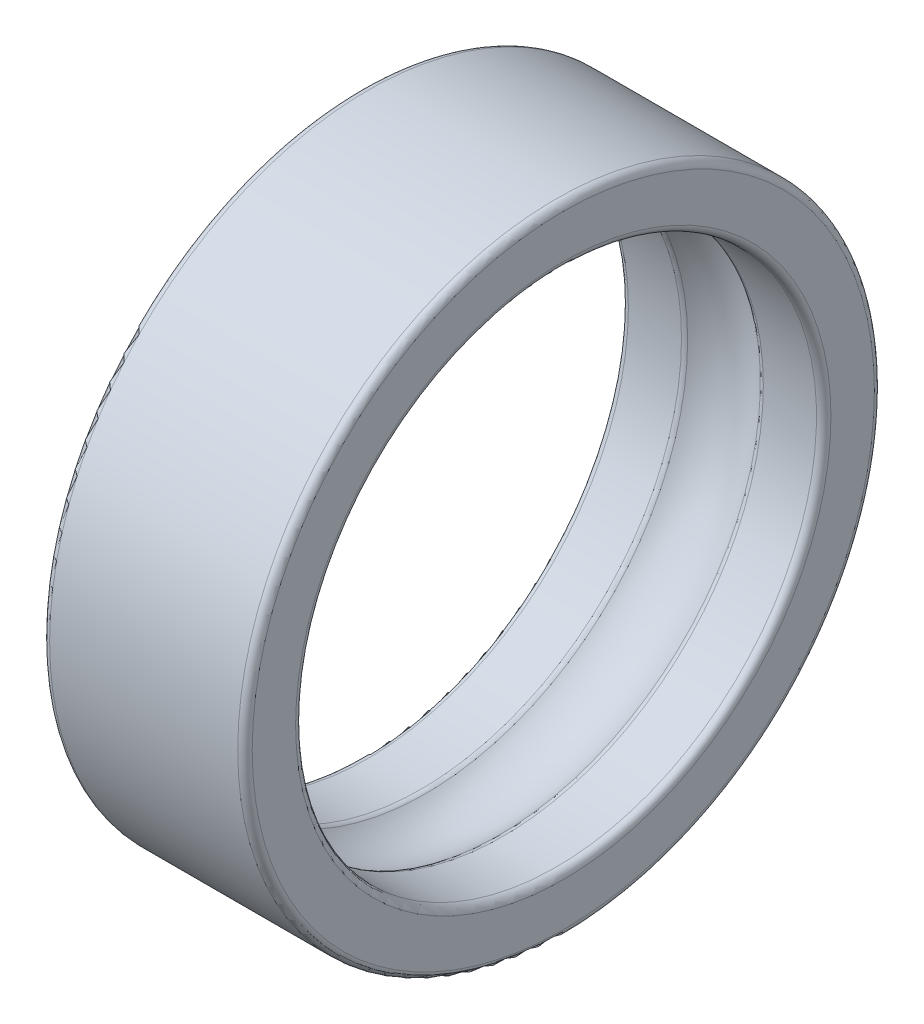
ISO-10303-21;
HEADER;
FILE_DESCRIPTION(('STEP AP214'),'2;1');
FILE_NAME('part.step','',(''),(''),'','','');
FILE_SCHEMA(('AUTOMOTIVE_DESIGN { 1 0 10303 214 1 1 1 1 }'));
ENDSEC;
DATA;
#1=APPLICATION_CONTEXT('core data for automotive mechanical design processes');
#2=APPLICATION_PROTOCOL_DEFINITION('international standard','automotive_design',2000,#1);
#3=PRODUCT_CONTEXT('',#1,'mechanical');
#4=PRODUCT('Part','Part','',(#3));
#5=PRODUCT_RELATED_PRODUCT_CATEGORY('part','',(#4));
#6=PRODUCT_DEFINITION_FORMATION('','',#4);
#7=PRODUCT_DEFINITION_CONTEXT('part definition',#1,'design');
#8=PRODUCT_DEFINITION('design','',#6,#7);
#9=PRODUCT_DEFINITION_SHAPE('','',#8);
#10=(LENGTH_UNIT() NAMED_UNIT(*) SI_UNIT(.MILLI.,.METRE.));
#11=(NAMED_UNIT(*) PLANE_ANGLE_UNIT() SI_UNIT($,.RADIAN.));
#12=(NAMED_UNIT(*) SI_UNIT($,.STERADIAN.) SOLID_ANGLE_UNIT());
#13=UNCERTAINTY_MEASURE_WITH_UNIT(LENGTH_MEASURE(1.E-05),#10,'distance_accuracy_value','');
#14=(GEOMETRIC_REPRESENTATION_CONTEXT(3) GLOBAL_UNCERTAINTY_ASSIGNED_CONTEXT((#13)) GLOBAL_UNIT_ASSIGNED_CONTEXT((#10,
#11,#12)) REPRESENTATION_CONTEXT('',''));
#15=CARTESIAN_POINT('',(0.,0.,0.));
#16=DIRECTION('',(0.,0.,1.));
#17=DIRECTION('',(1.,0.,0.));
#18=AXIS2_PLACEMENT_3D('',#15,#16,#17);
#19=CARTESIAN_POINT('',(-3.5,9.,0.));
#20=DIRECTION('',(1.,0.,0.));
#21=DIRECTION('',(0.,0.,-1.));
#22=AXIS2_PLACEMENT_3D('',#19,#20,#21);
#23=PLANE('',#22);
#24=CARTESIAN_POINT('',(-3.5,0.,0.));
#25=DIRECTION('',(1.,0.,0.));
#26=DIRECTION('',(0.,0.,-1.));
#27=AXIS2_PLACEMENT_3D('',#24,#25,#26);
#28=CIRCLE('',#27,10.75);
#29=CARTESIAN_POINT('',(-3.5,0.,-10.75));
#30=VERTEX_POINT('',#29);
#31=EDGE_CURVE('E58',#30,#30,#28,.F.);
#32=ORIENTED_EDGE('',*,*,#31,.T.);
#33=EDGE_LOOP('',(#32));
#34=FACE_BOUND('',#33,.T.);
#35=CARTESIAN_POINT('',(-3.5,0.,0.));
#36=DIRECTION('',(1.,0.,0.));
#37=DIRECTION('',(0.,0.,-1.));
#38=AXIS2_PLACEMENT_3D('',#35,#36,#37);
#39=CIRCLE('',#38,9.25);
#40=CARTESIAN_POINT('',(-3.5,0.,-9.25));
#41=VERTEX_POINT('',#40);
#42=EDGE_CURVE('E61',#41,#41,#39,.T.);
#43=ORIENTED_EDGE('',*,*,#42,.T.);
#44=EDGE_LOOP('',(#43));
#45=FACE_BOUND('',#44,.T.);
#46=ADVANCED_FACE('F33',(#34,#45),#23,.F.);
#47=CARTESIAN_POINT('',(-31.6676661264182,0.,0.));
#48=DIRECTION('',(-1.,0.,0.));
#49=DIRECTION('',(0.,0.,1.));
#50=AXIS2_PLACEMENT_3D('',#47,#48,#49);
#51=CYLINDRICAL_SURFACE('',#50,9.);
#52=CARTESIAN_POINT('',(-3.25,0.,0.));
#53=DIRECTION('',(1.,0.,0.));
#54=DIRECTION('',(0.,0.,-1.));
#55=AXIS2_PLACEMENT_3D('',#52,#53,#54);
#56=CIRCLE('',#55,9.);
#57=CARTESIAN_POINT('',(-3.25,0.,-9.));
#58=VERTEX_POINT('',#57);
#59=EDGE_CURVE('E52',#58,#58,#56,.F.);
#60=ORIENTED_EDGE('',*,*,#59,.T.);
#61=EDGE_LOOP('',(#60));
#62=FACE_BOUND('',#61,.T.);
#63=CARTESIAN_POINT('',(-1.4142135623731,0.,0.));
#64=DIRECTION('',(1.,0.,0.));
#65=DIRECTION('',(0.,0.,-1.));
#66=AXIS2_PLACEMENT_3D('',#63,#64,#65);
#67=CIRCLE('',#66,9.);
#68=CARTESIAN_POINT('',(-1.4142135623731,0.,-9.));
#69=VERTEX_POINT('',#68);
#70=EDGE_CURVE('E55',#69,#69,#67,.T.);
#71=ORIENTED_EDGE('',*,*,#70,.T.);
#72=EDGE_LOOP('',(#71));
#73=FACE_BOUND('',#72,.T.);
#74=ADVANCED_FACE('F89',(#62,#73),#51,.F.);
#75=CARTESIAN_POINT('',(0.,0.,0.));
#76=DIRECTION('',(-1.,0.,0.));
#77=DIRECTION('',(0.,0.,1.));
#78=AXIS2_PLACEMENT_3D('',#75,#76,#77);
#79=TOROIDAL_SURFACE('',#78,7.5,2.);
#80=CARTESIAN_POINT('',(-1.25707872210942,0.,0.));
#81=DIRECTION('',(1.,0.,0.));
#82=DIRECTION('',(0.,0.,-1.));
#83=AXIS2_PLACEMENT_3D('',#80,#81,#82);
#84=CIRCLE('',#83,9.05555555555556);
#85=CARTESIAN_POINT('',(-1.25707872210942,0.,-9.05555555555556));
#86=VERTEX_POINT('',#85);
#87=EDGE_CURVE('E43',#86,#86,#84,.F.);
#88=ORIENTED_EDGE('',*,*,#87,.T.);
#89=EDGE_LOOP('',(#88));
#90=FACE_BOUND('',#89,.T.);
#91=CARTESIAN_POINT('',(1.25707872210942,0.,0.));
#92=DIRECTION('',(-1.,0.,0.));
#93=DIRECTION('',(0.,0.,1.));
#94=AXIS2_PLACEMENT_3D('',#91,#92,#93);
#95=CIRCLE('',#94,9.05555555555556);
#96=CARTESIAN_POINT('',(1.25707872210942,0.,9.05555555555556));
#97=VERTEX_POINT('',#96);
#98=EDGE_CURVE('E47',#97,#97,#95,.F.);
#99=ORIENTED_EDGE('',*,*,#98,.T.);
#100=EDGE_LOOP('',(#99));
#101=FACE_BOUND('',#100,.T.);
#102=ADVANCED_FACE('F100',(#90,#101),#79,.F.);
#103=CARTESIAN_POINT('',(-31.6676661264182,0.,0.));
#104=DIRECTION('',(-1.,0.,0.));
#105=DIRECTION('',(0.,0.,1.));
#106=AXIS2_PLACEMENT_3D('',#103,#104,#105);
#107=CYLINDRICAL_SURFACE('',#106,9.);
#108=CARTESIAN_POINT('',(1.4142135623731,0.,0.));
#109=DIRECTION('',(1.,0.,0.));
#110=DIRECTION('',(0.,0.,-1.));
#111=AXIS2_PLACEMENT_3D('',#108,#109,#110);
#112=CIRCLE('',#111,9.);
#113=CARTESIAN_POINT('',(1.4142135623731,0.,-9.));
#114=VERTEX_POINT('',#113);
#115=EDGE_CURVE('E10',#114,#114,#112,.F.);
#116=ORIENTED_EDGE('',*,*,#115,.T.);
#117=EDGE_LOOP('',(#116));
#118=FACE_BOUND('',#117,.T.);
#119=CARTESIAN_POINT('',(3.25,0.,0.));
#120=DIRECTION('',(-1.,0.,0.));
#121=DIRECTION('',(0.,0.,1.));
#122=AXIS2_PLACEMENT_3D('',#119,#120,#121);
#123=CIRCLE('',#122,9.);
#124=CARTESIAN_POINT('',(3.25,0.,9.));
#125=VERTEX_POINT('',#124);
#126=EDGE_CURVE('E39',#125,#125,#123,.F.);
#127=ORIENTED_EDGE('',*,*,#126,.T.);
#128=EDGE_LOOP('',(#127));
#129=FACE_BOUND('',#128,.T.);
#130=ADVANCED_FACE('F111',(#118,#129),#107,.F.);
#131=CARTESIAN_POINT('',(3.5,9.,0.));
#132=DIRECTION('',(-1.,0.,0.));
#133=DIRECTION('',(0.,0.,1.));
#134=AXIS2_PLACEMENT_3D('',#131,#132,#133);
#135=PLANE('',#134);
#136=CARTESIAN_POINT('',(3.5,0.,0.));
#137=DIRECTION('',(-1.,0.,0.));
#138=DIRECTION('',(0.,0.,1.));
#139=AXIS2_PLACEMENT_3D('',#136,#137,#138);
#140=CIRCLE('',#139,10.75);
#141=CARTESIAN_POINT('',(3.5,0.,10.75));
#142=VERTEX_POINT('',#141);
#143=EDGE_CURVE('E64',#142,#142,#140,.F.);
#144=ORIENTED_EDGE('',*,*,#143,.T.);
#145=EDGE_LOOP('',(#144));
#146=FACE_BOUND('',#145,.T.);
#147=CARTESIAN_POINT('',(3.5,0.,0.));
#148=DIRECTION('',(-1.,0.,0.));
#149=DIRECTION('',(0.,0.,1.));
#150=AXIS2_PLACEMENT_3D('',#147,#148,#149);
#151=CIRCLE('',#150,9.25);
#152=CARTESIAN_POINT('',(3.5,0.,9.25));
#153=VERTEX_POINT('',#152);
#154=EDGE_CURVE('E67',#153,#153,#151,.T.);
#155=ORIENTED_EDGE('',*,*,#154,.T.);
#156=EDGE_LOOP('',(#155));
#157=FACE_BOUND('',#156,.T.);
#158=ADVANCED_FACE('F130',(#146,#157),#135,.F.);
#159=CARTESIAN_POINT('',(-31.6676661264182,0.,0.));
#160=DIRECTION('',(-1.,0.,0.));
#161=DIRECTION('',(0.,0.,1.));
#162=AXIS2_PLACEMENT_3D('',#159,#160,#161);
#163=CYLINDRICAL_SURFACE('',#162,11.);
#164=CARTESIAN_POINT('',(3.25,0.,0.));
#165=DIRECTION('',(-1.,0.,0.));
#166=DIRECTION('',(0.,0.,1.));
#167=AXIS2_PLACEMENT_3D('',#164,#165,#166);
#168=CIRCLE('',#167,11.);
#169=CARTESIAN_POINT('',(3.25,0.,11.));
#170=VERTEX_POINT('',#169);
#171=EDGE_CURVE('E70',#170,#170,#168,.T.);
#172=ORIENTED_EDGE('',*,*,#171,.T.);
#173=EDGE_LOOP('',(#172));
#174=FACE_BOUND('',#173,.T.);
#175=CARTESIAN_POINT('',(-3.25,0.,0.));
#176=DIRECTION('',(1.,0.,0.));
#177=DIRECTION('',(0.,0.,-1.));
#178=AXIS2_PLACEMENT_3D('',#175,#176,#177);
#179=CIRCLE('',#178,11.);
#180=CARTESIAN_POINT('',(-3.25,0.,-11.));
#181=VERTEX_POINT('',#180);
#182=EDGE_CURVE('E73',#181,#181,#179,.T.);
#183=ORIENTED_EDGE('',*,*,#182,.T.);
#184=EDGE_LOOP('',(#183));
#185=FACE_BOUND('',#184,.T.);
#186=ADVANCED_FACE('F77',(#174,#185),#163,.T.);
#187=CARTESIAN_POINT('',(3.25,0.,0.));
#188=DIRECTION('',(-1.,0.,0.));
#189=DIRECTION('',(0.,0.,1.));
#190=AXIS2_PLACEMENT_3D('',#187,#188,#189);
#191=TOROIDAL_SURFACE('',#190,10.75,0.25);
#192=ORIENTED_EDGE('',*,*,#143,.F.);
#193=EDGE_LOOP('',(#192));
#194=FACE_BOUND('',#193,.T.);
#195=ORIENTED_EDGE('',*,*,#171,.F.);
#196=EDGE_LOOP('',(#195));
#197=FACE_BOUND('',#196,.T.);
#198=ADVANCED_FACE('F83',(#194,#197),#191,.T.);
#199=CARTESIAN_POINT('',(-3.25,0.,0.));
#200=DIRECTION('',(1.,0.,0.));
#201=DIRECTION('',(0.,0.,-1.));
#202=AXIS2_PLACEMENT_3D('',#199,#200,#201);
#203=TOROIDAL_SURFACE('',#202,10.75,0.25);
#204=ORIENTED_EDGE('',*,*,#182,.F.);
#205=EDGE_LOOP('',(#204));
#206=FACE_BOUND('',#205,.T.);
#207=ORIENTED_EDGE('',*,*,#31,.F.);
#208=EDGE_LOOP('',(#207));
#209=FACE_BOUND('',#208,.T.);
#210=ADVANCED_FACE('F79',(#206,#209),#203,.T.);
#211=CARTESIAN_POINT('',(-3.25,0.,0.));
#212=DIRECTION('',(1.,0.,0.));
#213=DIRECTION('',(0.,0.,-1.));
#214=AXIS2_PLACEMENT_3D('',#211,#212,#213);
#215=TOROIDAL_SURFACE('',#214,9.25,0.25);
#216=ORIENTED_EDGE('',*,*,#42,.F.);
#217=EDGE_LOOP('',(#216));
#218=FACE_BOUND('',#217,.T.);
#219=ORIENTED_EDGE('',*,*,#59,.F.);
#220=EDGE_LOOP('',(#219));
#221=FACE_BOUND('',#220,.T.);
#222=ADVANCED_FACE('F82',(#218,#221),#215,.T.);
#223=CARTESIAN_POINT('',(-1.4142135623731,0.,0.));
#224=DIRECTION('',(1.,0.,0.));
#225=DIRECTION('',(0.,0.,-1.));
#226=AXIS2_PLACEMENT_3D('',#223,#224,#225);
#227=TOROIDAL_SURFACE('',#226,9.25,0.25);
#228=ORIENTED_EDGE('',*,*,#70,.F.);
#229=EDGE_LOOP('',(#228));
#230=FACE_BOUND('',#229,.T.);
#231=ORIENTED_EDGE('',*,*,#87,.F.);
#232=EDGE_LOOP('',(#231));
#233=FACE_BOUND('',#232,.T.);
#234=ADVANCED_FACE('F94',(#230,#233),#227,.T.);
#235=CARTESIAN_POINT('',(1.4142135623731,0.,0.));
#236=DIRECTION('',(1.,0.,0.));
#237=DIRECTION('',(0.,0.,-1.));
#238=AXIS2_PLACEMENT_3D('',#235,#236,#237);
#239=TOROIDAL_SURFACE('',#238,9.25,0.25);
#240=ORIENTED_EDGE('',*,*,#98,.F.);
#241=EDGE_LOOP('',(#240));
#242=FACE_BOUND('',#241,.T.);
#243=ORIENTED_EDGE('',*,*,#115,.F.);
#244=EDGE_LOOP('',(#243));
#245=FACE_BOUND('',#244,.T.);
#246=ADVANCED_FACE('F105',(#242,#245),#239,.T.);
#247=CARTESIAN_POINT('',(3.25,0.,0.));
#248=DIRECTION('',(-1.,0.,0.));
#249=DIRECTION('',(0.,0.,1.));
#250=AXIS2_PLACEMENT_3D('',#247,#248,#249);
#251=TOROIDAL_SURFACE('',#250,9.25,0.25);
#252=ORIENTED_EDGE('',*,*,#126,.F.);
#253=EDGE_LOOP('',(#252));
#254=FACE_BOUND('',#253,.T.);
#255=ORIENTED_EDGE('',*,*,#154,.F.);
#256=EDGE_LOOP('',(#255));
#257=FACE_BOUND('',#256,.T.);
#258=ADVANCED_FACE('F117',(#254,#257),#251,.T.);
#259=CLOSED_SHELL('',(#46,#74,#102,#130,#158,#186,#198,#210,#222,#234,#246,#258));
#260=MANIFOLD_SOLID_BREP('B2',#259);
#261=ADVANCED_BREP_SHAPE_REPRESENTATION('',(#18,#260),#14);
#262=SHAPE_DEFINITION_REPRESENTATION(#9,#261);
ENDSEC;
END-ISO-10303-21;
